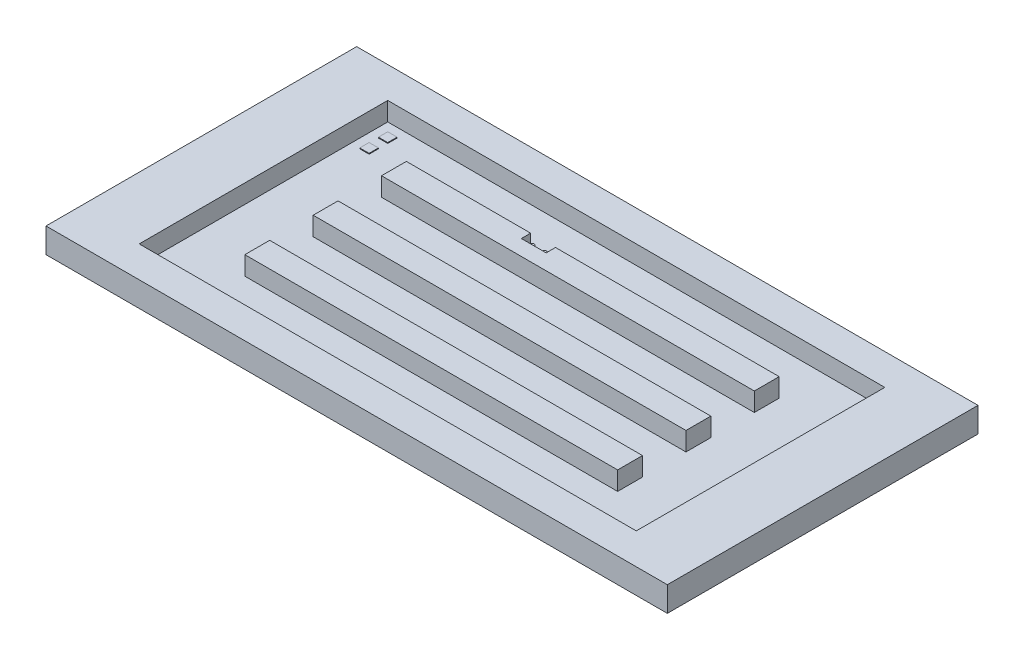
ISO-10303-21;
HEADER;
FILE_DESCRIPTION(('STEP AP214'),'2;1');
FILE_NAME('part.step','',(''),(''),'','','');
FILE_SCHEMA(('AUTOMOTIVE_DESIGN { 1 0 10303 214 1 1 1 1 }'));
ENDSEC;
DATA;
#1=APPLICATION_CONTEXT('core data for automotive mechanical design processes');
#2=APPLICATION_PROTOCOL_DEFINITION('international standard','automotive_design',2000,#1);
#3=PRODUCT_CONTEXT('',#1,'mechanical');
#4=PRODUCT('Part','Part','',(#3));
#5=PRODUCT_RELATED_PRODUCT_CATEGORY('part','',(#4));
#6=PRODUCT_DEFINITION_FORMATION('','',#4);
#7=PRODUCT_DEFINITION_CONTEXT('part definition',#1,'design');
#8=PRODUCT_DEFINITION('design','',#6,#7);
#9=PRODUCT_DEFINITION_SHAPE('','',#8);
#10=(LENGTH_UNIT() NAMED_UNIT(*) SI_UNIT(.MILLI.,.METRE.));
#11=(NAMED_UNIT(*) PLANE_ANGLE_UNIT() SI_UNIT($,.RADIAN.));
#12=(NAMED_UNIT(*) SI_UNIT($,.STERADIAN.) SOLID_ANGLE_UNIT());
#13=UNCERTAINTY_MEASURE_WITH_UNIT(LENGTH_MEASURE(1.E-05),#10,'distance_accuracy_value','');
#14=(GEOMETRIC_REPRESENTATION_CONTEXT(3) GLOBAL_UNCERTAINTY_ASSIGNED_CONTEXT((#13)) GLOBAL_UNIT_ASSIGNED_CONTEXT((#10,
#11,#12)) REPRESENTATION_CONTEXT('',''));
#15=CARTESIAN_POINT('',(0.,0.,0.));
#16=DIRECTION('',(0.,0.,1.));
#17=DIRECTION('',(1.,0.,0.));
#18=AXIS2_PLACEMENT_3D('',#15,#16,#17);
#19=CARTESIAN_POINT('',(-1000.,200.,-1150.));
#20=DIRECTION('',(0.,1.,0.));
#21=DIRECTION('',(0.,0.,1.));
#22=AXIS2_PLACEMENT_3D('',#19,#20,#21);
#23=PLANE('',#22);
#24=CARTESIAN_POINT('',(-900.000000000002,200.,-1221.98698626549));
#25=DIRECTION('',(0.,1.,0.));
#26=DIRECTION('',(0.,0.,1.));
#27=AXIS2_PLACEMENT_3D('',#24,#25,#26);
#28=CIRCLE('',#27,33.);
#29=CARTESIAN_POINT('',(-900.000000000002,200.,-1188.98698626549));
#30=VERTEX_POINT('',#29);
#31=EDGE_CURVE('E265',#30,#30,#28,.T.);
#32=ORIENTED_EDGE('',*,*,#31,.F.);
#33=EDGE_LOOP('',(#32));
#34=FACE_BOUND('',#33,.T.);
#35=DIRECTION('',(0.,0.,1.));
#36=VECTOR('',#35,1.);
#37=CARTESIAN_POINT('',(-1000.,200.,-1300.));
#38=LINE('',#37,#36);
#39=CARTESIAN_POINT('',(-1000.,200.,-1300.));
#40=VERTEX_POINT('',#39);
#41=CARTESIAN_POINT('',(-1000.,200.,-1150.));
#42=VERTEX_POINT('',#41);
#43=EDGE_CURVE('E241',#40,#42,#38,.T.);
#44=ORIENTED_EDGE('',*,*,#43,.T.);
#45=DIRECTION('',(1.,0.,0.));
#46=VECTOR('',#45,1.);
#47=CARTESIAN_POINT('',(-1000.,200.,-1150.));
#48=LINE('',#47,#46);
#49=CARTESIAN_POINT('',(-600.000000000001,200.,-1150.));
#50=VERTEX_POINT('',#49);
#51=EDGE_CURVE('E250',#42,#50,#48,.T.);
#52=ORIENTED_EDGE('',*,*,#51,.T.);
#53=DIRECTION('',(0.,0.,-1.));
#54=VECTOR('',#53,1.);
#55=CARTESIAN_POINT('',(-600.000000000001,200.,-1300.));
#56=LINE('',#55,#54);
#57=CARTESIAN_POINT('',(-600.000000000001,200.,-1300.));
#58=VERTEX_POINT('',#57);
#59=EDGE_CURVE('E255',#50,#58,#56,.T.);
#60=ORIENTED_EDGE('',*,*,#59,.T.);
#61=DIRECTION('',(-1.,0.,0.));
#62=VECTOR('',#61,1.);
#63=CARTESIAN_POINT('',(-1000.,200.,-1300.));
#64=LINE('',#63,#62);
#65=EDGE_CURVE('E247',#58,#40,#64,.T.);
#66=ORIENTED_EDGE('',*,*,#65,.T.);
#67=EDGE_LOOP('',(#44,#52,#60,#66));
#68=FACE_BOUND('',#67,.T.);
#69=CARTESIAN_POINT('',(-700.000000000002,200.,-1221.98698626549));
#70=DIRECTION('',(0.,1.,0.));
#71=DIRECTION('',(0.,0.,1.));
#72=AXIS2_PLACEMENT_3D('',#69,#70,#71);
#73=CIRCLE('',#72,33.);
#74=CARTESIAN_POINT('',(-700.000000000002,200.,-1188.98698626549));
#75=VERTEX_POINT('',#74);
#76=EDGE_CURVE('E943',#75,#75,#73,.T.);
#77=ORIENTED_EDGE('',*,*,#76,.F.);
#78=EDGE_LOOP('',(#77));
#79=FACE_BOUND('',#78,.T.);
#80=ADVANCED_FACE('F31',(#34,#68,#79),#23,.T.);
#81=CARTESIAN_POINT('',(-4000.,100.,2000.));
#82=DIRECTION('',(0.,-1.,0.));
#83=DIRECTION('',(0.,0.,-1.));
#84=AXIS2_PLACEMENT_3D('',#81,#82,#83);
#85=PLANE('',#84);
#86=DIRECTION('',(0.,0.,1.));
#87=VECTOR('',#86,1.);
#88=CARTESIAN_POINT('',(-3850.,100.,-1850.));
#89=LINE('',#88,#87);
#90=CARTESIAN_POINT('',(-3850.,100.,-1850.));
#91=VERTEX_POINT('',#90);
#92=CARTESIAN_POINT('',(-3850.,100.,-1700.));
#93=VERTEX_POINT('',#92);
#94=EDGE_CURVE('E309',#91,#93,#89,.T.);
#95=ORIENTED_EDGE('',*,*,#94,.F.);
#96=DIRECTION('',(-1.,0.,0.));
#97=VECTOR('',#96,1.);
#98=CARTESIAN_POINT('',(-3850.,100.,-1850.));
#99=LINE('',#98,#97);
#100=CARTESIAN_POINT('',(-3700.,100.,-1850.));
#101=VERTEX_POINT('',#100);
#102=EDGE_CURVE('E314',#101,#91,#99,.T.);
#103=ORIENTED_EDGE('',*,*,#102,.F.);
#104=DIRECTION('',(0.,0.,-1.));
#105=VECTOR('',#104,1.);
#106=CARTESIAN_POINT('',(-3700.,100.,-1850.));
#107=LINE('',#106,#105);
#108=CARTESIAN_POINT('',(-3700.,100.,-1700.));
#109=VERTEX_POINT('',#108);
#110=EDGE_CURVE('E326',#109,#101,#107,.T.);
#111=ORIENTED_EDGE('',*,*,#110,.F.);
#112=DIRECTION('',(1.,0.,0.));
#113=VECTOR('',#112,1.);
#114=CARTESIAN_POINT('',(-3850.,100.,-1700.));
#115=LINE('',#114,#113);
#116=EDGE_CURVE('E323',#93,#109,#115,.T.);
#117=ORIENTED_EDGE('',*,*,#116,.F.);
#118=EDGE_LOOP('',(#95,#103,#111,#117));
#119=FACE_BOUND('',#118,.T.);
#120=DIRECTION('',(0.,0.,1.));
#121=VECTOR('',#120,1.);
#122=CARTESIAN_POINT('',(-3000.,100.,900.000000000001));
#123=LINE('',#122,#121);
#124=CARTESIAN_POINT('',(-3000.,100.,900.000000000001));
#125=VERTEX_POINT('',#124);
#126=CARTESIAN_POINT('',(-3000.,100.,1300.));
#127=VERTEX_POINT('',#126);
#128=EDGE_CURVE('E343',#125,#127,#123,.T.);
#129=ORIENTED_EDGE('',*,*,#128,.F.);
#130=DIRECTION('',(-1.,0.,0.));
#131=VECTOR('',#130,1.);
#132=CARTESIAN_POINT('',(-3000.,100.,900.000000000001));
#133=LINE('',#132,#131);
#134=CARTESIAN_POINT('',(3000.,100.,900.000000000001));
#135=VERTEX_POINT('',#134);
#136=EDGE_CURVE('E353',#135,#125,#133,.T.);
#137=ORIENTED_EDGE('',*,*,#136,.F.);
#138=DIRECTION('',(0.,0.,-1.));
#139=VECTOR('',#138,1.);
#140=CARTESIAN_POINT('',(3000.,100.,900.000000000001));
#141=LINE('',#140,#139);
#142=CARTESIAN_POINT('',(3000.,100.,1300.));
#143=VERTEX_POINT('',#142);
#144=EDGE_CURVE('E350',#143,#135,#141,.T.);
#145=ORIENTED_EDGE('',*,*,#144,.F.);
#146=DIRECTION('',(1.,0.,0.));
#147=VECTOR('',#146,1.);
#148=CARTESIAN_POINT('',(-3000.,100.,1300.));
#149=LINE('',#148,#147);
#150=EDGE_CURVE('E346',#127,#143,#149,.T.);
#151=ORIENTED_EDGE('',*,*,#150,.F.);
#152=EDGE_LOOP('',(#129,#137,#145,#151));
#153=FACE_BOUND('',#152,.T.);
#154=DIRECTION('',(0.,0.,-1.));
#155=VECTOR('',#154,1.);
#156=CARTESIAN_POINT('',(3000.,100.,-200.));
#157=LINE('',#156,#155);
#158=CARTESIAN_POINT('',(3000.,100.,200.));
#159=VERTEX_POINT('',#158);
#160=CARTESIAN_POINT('',(3000.,100.,-200.));
#161=VERTEX_POINT('',#160);
#162=EDGE_CURVE('E376',#159,#161,#157,.T.);
#163=ORIENTED_EDGE('',*,*,#162,.F.);
#164=DIRECTION('',(1.,0.,0.));
#165=VECTOR('',#164,1.);
#166=CARTESIAN_POINT('',(3000.,100.,200.));
#167=LINE('',#166,#165);
#168=CARTESIAN_POINT('',(-3000.,100.,200.000000000001));
#169=VERTEX_POINT('',#168);
#170=EDGE_CURVE('E386',#169,#159,#167,.T.);
#171=ORIENTED_EDGE('',*,*,#170,.F.);
#172=DIRECTION('',(0.,0.,1.));
#173=VECTOR('',#172,1.);
#174=CARTESIAN_POINT('',(-3000.,100.,-199.999999999999));
#175=LINE('',#174,#173);
#176=CARTESIAN_POINT('',(-3000.,100.,-199.999999999999));
#177=VERTEX_POINT('',#176);
#178=EDGE_CURVE('E383',#177,#169,#175,.T.);
#179=ORIENTED_EDGE('',*,*,#178,.F.);
#180=DIRECTION('',(-1.,0.,0.));
#181=VECTOR('',#180,1.);
#182=CARTESIAN_POINT('',(3000.,100.,-200.));
#183=LINE('',#182,#181);
#184=EDGE_CURVE('E379',#161,#177,#183,.T.);
#185=ORIENTED_EDGE('',*,*,#184,.F.);
#186=EDGE_LOOP('',(#163,#171,#179,#185));
#187=FACE_BOUND('',#186,.T.);
#188=DIRECTION('',(0.,0.,1.));
#189=VECTOR('',#188,1.);
#190=CARTESIAN_POINT('',(-3000.,100.,-1300.));
#191=LINE('',#190,#189);
#192=CARTESIAN_POINT('',(-3000.,100.,-1300.));
#193=VERTEX_POINT('',#192);
#194=CARTESIAN_POINT('',(-3000.,100.,-899.999999999999));
#195=VERTEX_POINT('',#194);
#196=EDGE_CURVE('E409',#193,#195,#191,.T.);
#197=ORIENTED_EDGE('',*,*,#196,.F.);
#198=DIRECTION('',(-1.,0.,0.));
#199=VECTOR('',#198,1.);
#200=CARTESIAN_POINT('',(-3000.,100.,-1300.));
#201=LINE('',#200,#199);
#202=CARTESIAN_POINT('',(3000.,100.,-1300.));
#203=VERTEX_POINT('',#202);
#204=EDGE_CURVE('E419',#203,#193,#201,.T.);
#205=ORIENTED_EDGE('',*,*,#204,.F.);
#206=DIRECTION('',(0.,0.,-1.));
#207=VECTOR('',#206,1.);
#208=CARTESIAN_POINT('',(3000.,100.,-1300.));
#209=LINE('',#208,#207);
#210=CARTESIAN_POINT('',(3000.,100.,-899.999999999999));
#211=VERTEX_POINT('',#210);
#212=EDGE_CURVE('E416',#211,#203,#209,.T.);
#213=ORIENTED_EDGE('',*,*,#212,.F.);
#214=DIRECTION('',(1.,0.,0.));
#215=VECTOR('',#214,1.);
#216=CARTESIAN_POINT('',(-3000.,100.,-899.999999999999));
#217=LINE('',#216,#215);
#218=EDGE_CURVE('E412',#195,#211,#217,.T.);
#219=ORIENTED_EDGE('',*,*,#218,.F.);
#220=EDGE_LOOP('',(#197,#205,#213,#219));
#221=FACE_BOUND('',#220,.T.);
#222=DIRECTION('',(0.,0.,1.));
#223=VECTOR('',#222,1.);
#224=CARTESIAN_POINT('',(-4000.,100.,-2000.));
#225=LINE('',#224,#223);
#226=CARTESIAN_POINT('',(-4000.,100.,-2000.));
#227=VERTEX_POINT('',#226);
#228=CARTESIAN_POINT('',(-4000.,100.,2000.));
#229=VERTEX_POINT('',#228);
#230=EDGE_CURVE('E444',#227,#229,#225,.T.);
#231=ORIENTED_EDGE('',*,*,#230,.T.);
#232=DIRECTION('',(1.,0.,0.));
#233=VECTOR('',#232,1.);
#234=CARTESIAN_POINT('',(4000.,100.,2000.));
#235=LINE('',#234,#233);
#236=CARTESIAN_POINT('',(4000.,100.,2000.));
#237=VERTEX_POINT('',#236);
#238=EDGE_CURVE('E447',#229,#237,#235,.T.);
#239=ORIENTED_EDGE('',*,*,#238,.T.);
#240=DIRECTION('',(0.,0.,-1.));
#241=VECTOR('',#240,1.);
#242=CARTESIAN_POINT('',(4000.,100.,-2000.));
#243=LINE('',#242,#241);
#244=CARTESIAN_POINT('',(4000.,100.,-2000.));
#245=VERTEX_POINT('',#244);
#246=EDGE_CURVE('E451',#237,#245,#243,.T.);
#247=ORIENTED_EDGE('',*,*,#246,.T.);
#248=DIRECTION('',(-1.,0.,0.));
#249=VECTOR('',#248,1.);
#250=CARTESIAN_POINT('',(4000.,100.,-2000.));
#251=LINE('',#250,#249);
#252=EDGE_CURVE('E454',#245,#227,#251,.T.);
#253=ORIENTED_EDGE('',*,*,#252,.T.);
#254=EDGE_LOOP('',(#231,#239,#247,#253));
#255=FACE_BOUND('',#254,.T.);
#256=DIRECTION('',(0.,0.,-1.));
#257=VECTOR('',#256,1.);
#258=CARTESIAN_POINT('',(-3700.,100.,-1550.));
#259=LINE('',#258,#257);
#260=CARTESIAN_POINT('',(-3700.,100.,-1400.));
#261=VERTEX_POINT('',#260);
#262=CARTESIAN_POINT('',(-3700.,100.,-1550.));
#263=VERTEX_POINT('',#262);
#264=EDGE_CURVE('E275',#261,#263,#259,.T.);
#265=ORIENTED_EDGE('',*,*,#264,.F.);
#266=DIRECTION('',(1.,0.,0.));
#267=VECTOR('',#266,1.);
#268=CARTESIAN_POINT('',(-3700.,100.,-1400.));
#269=LINE('',#268,#267);
#270=CARTESIAN_POINT('',(-3850.,100.,-1400.));
#271=VERTEX_POINT('',#270);
#272=EDGE_CURVE('E284',#271,#261,#269,.T.);
#273=ORIENTED_EDGE('',*,*,#272,.F.);
#274=DIRECTION('',(0.,0.,1.));
#275=VECTOR('',#274,1.);
#276=CARTESIAN_POINT('',(-3850.,100.,-1550.));
#277=LINE('',#276,#275);
#278=CARTESIAN_POINT('',(-3850.,100.,-1550.));
#279=VERTEX_POINT('',#278);
#280=EDGE_CURVE('E294',#279,#271,#277,.T.);
#281=ORIENTED_EDGE('',*,*,#280,.F.);
#282=DIRECTION('',(-1.,0.,0.));
#283=VECTOR('',#282,1.);
#284=CARTESIAN_POINT('',(-3700.,100.,-1550.));
#285=LINE('',#284,#283);
#286=EDGE_CURVE('E54',#263,#279,#285,.T.);
#287=ORIENTED_EDGE('',*,*,#286,.F.);
#288=EDGE_LOOP('',(#265,#273,#281,#287));
#289=FACE_BOUND('',#288,.T.);
#290=ADVANCED_FACE('F526',(#119,#153,#187,#221,#255,#289),#85,.F.);
#291=CARTESIAN_POINT('',(5000.,400.,-2500.));
#292=DIRECTION('',(-1.,0.,0.));
#293=DIRECTION('',(0.,0.,1.));
#294=AXIS2_PLACEMENT_3D('',#291,#292,#293);
#295=PLANE('',#294);
#296=DIRECTION('',(0.,0.,-1.));
#297=VECTOR('',#296,1.);
#298=CARTESIAN_POINT('',(5000.,0.,-2500.));
#299=LINE('',#298,#297);
#300=CARTESIAN_POINT('',(5000.,0.,2500.));
#301=VERTEX_POINT('',#300);
#302=CARTESIAN_POINT('',(5000.,0.,-2500.));
#303=VERTEX_POINT('',#302);
#304=EDGE_CURVE('E469',#301,#303,#299,.T.);
#305=ORIENTED_EDGE('',*,*,#304,.T.);
#306=DIRECTION('',(0.,-1.,0.));
#307=VECTOR('',#306,1.);
#308=CARTESIAN_POINT('',(5000.,400.,-2500.));
#309=LINE('',#308,#307);
#310=CARTESIAN_POINT('',(5000.,400.,-2500.));
#311=VERTEX_POINT('',#310);
#312=EDGE_CURVE('E11',#311,#303,#309,.T.);
#313=ORIENTED_EDGE('',*,*,#312,.F.);
#314=DIRECTION('',(0.,0.,-1.));
#315=VECTOR('',#314,1.);
#316=CARTESIAN_POINT('',(5000.,400.,-2500.));
#317=LINE('',#316,#315);
#318=CARTESIAN_POINT('',(5000.,400.,2500.));
#319=VERTEX_POINT('',#318);
#320=EDGE_CURVE('E476',#319,#311,#317,.T.);
#321=ORIENTED_EDGE('',*,*,#320,.F.);
#322=DIRECTION('',(0.,-1.,0.));
#323=VECTOR('',#322,1.);
#324=CARTESIAN_POINT('',(5000.,400.,2500.));
#325=LINE('',#324,#323);
#326=EDGE_CURVE('E486',#319,#301,#325,.T.);
#327=ORIENTED_EDGE('',*,*,#326,.T.);
#328=EDGE_LOOP('',(#305,#313,#321,#327));
#329=FACE_BOUND('',#328,.T.);
#330=ADVANCED_FACE('F33',(#329),#295,.F.);
#331=CARTESIAN_POINT('',(-5000.,400.,-2500.));
#332=DIRECTION('',(0.,0.,1.));
#333=DIRECTION('',(1.,0.,0.));
#334=AXIS2_PLACEMENT_3D('',#331,#332,#333);
#335=PLANE('',#334);
#336=DIRECTION('',(-1.,0.,0.));
#337=VECTOR('',#336,1.);
#338=CARTESIAN_POINT('',(-5000.,0.,-2500.));
#339=LINE('',#338,#337);
#340=CARTESIAN_POINT('',(-5000.,0.,-2500.));
#341=VERTEX_POINT('',#340);
#342=EDGE_CURVE('E489',#303,#341,#339,.T.);
#343=ORIENTED_EDGE('',*,*,#342,.T.);
#344=DIRECTION('',(0.,-1.,0.));
#345=VECTOR('',#344,1.);
#346=CARTESIAN_POINT('',(-5000.,400.,-2500.));
#347=LINE('',#346,#345);
#348=CARTESIAN_POINT('',(-5000.,400.,-2500.));
#349=VERTEX_POINT('',#348);
#350=EDGE_CURVE('E39',#349,#341,#347,.T.);
#351=ORIENTED_EDGE('',*,*,#350,.F.);
#352=DIRECTION('',(-1.,0.,0.));
#353=VECTOR('',#352,1.);
#354=CARTESIAN_POINT('',(-5000.,400.,-2500.));
#355=LINE('',#354,#353);
#356=EDGE_CURVE('E479',#311,#349,#355,.T.);
#357=ORIENTED_EDGE('',*,*,#356,.F.);
#358=ORIENTED_EDGE('',*,*,#312,.T.);
#359=EDGE_LOOP('',(#343,#351,#357,#358));
#360=FACE_BOUND('',#359,.T.);
#361=ADVANCED_FACE('F519',(#360),#335,.F.);
#362=CARTESIAN_POINT('',(-5000.,400.,-2500.));
#363=DIRECTION('',(1.,0.,0.));
#364=DIRECTION('',(0.,0.,-1.));
#365=AXIS2_PLACEMENT_3D('',#362,#363,#364);
#366=PLANE('',#365);
#367=DIRECTION('',(0.,0.,1.));
#368=VECTOR('',#367,1.);
#369=CARTESIAN_POINT('',(-5000.,0.,-2500.));
#370=LINE('',#369,#368);
#371=CARTESIAN_POINT('',(-5000.,0.,2500.));
#372=VERTEX_POINT('',#371);
#373=EDGE_CURVE('E491',#341,#372,#370,.T.);
#374=ORIENTED_EDGE('',*,*,#373,.T.);
#375=DIRECTION('',(0.,-1.,0.));
#376=VECTOR('',#375,1.);
#377=CARTESIAN_POINT('',(-5000.,400.,2500.));
#378=LINE('',#377,#376);
#379=CARTESIAN_POINT('',(-5000.,400.,2500.));
#380=VERTEX_POINT('',#379);
#381=EDGE_CURVE('E496',#380,#372,#378,.T.);
#382=ORIENTED_EDGE('',*,*,#381,.F.);
#383=DIRECTION('',(0.,0.,1.));
#384=VECTOR('',#383,1.);
#385=CARTESIAN_POINT('',(-5000.,400.,-2500.));
#386=LINE('',#385,#384);
#387=EDGE_CURVE('E482',#349,#380,#386,.T.);
#388=ORIENTED_EDGE('',*,*,#387,.F.);
#389=ORIENTED_EDGE('',*,*,#350,.T.);
#390=EDGE_LOOP('',(#374,#382,#388,#389));
#391=FACE_BOUND('',#390,.T.);
#392=ADVANCED_FACE('F503',(#391),#366,.F.);
#393=CARTESIAN_POINT('',(-5000.,400.,2500.));
#394=DIRECTION('',(0.,0.,-1.));
#395=DIRECTION('',(-1.,0.,0.));
#396=AXIS2_PLACEMENT_3D('',#393,#394,#395);
#397=PLANE('',#396);
#398=DIRECTION('',(1.,0.,0.));
#399=VECTOR('',#398,1.);
#400=CARTESIAN_POINT('',(-5000.,0.,2500.));
#401=LINE('',#400,#399);
#402=EDGE_CURVE('E480',#372,#301,#401,.T.);
#403=ORIENTED_EDGE('',*,*,#402,.T.);
#404=ORIENTED_EDGE('',*,*,#326,.F.);
#405=DIRECTION('',(1.,0.,0.));
#406=VECTOR('',#405,1.);
#407=CARTESIAN_POINT('',(-5000.,400.,2500.));
#408=LINE('',#407,#406);
#409=EDGE_CURVE('E484',#380,#319,#408,.T.);
#410=ORIENTED_EDGE('',*,*,#409,.F.);
#411=ORIENTED_EDGE('',*,*,#381,.T.);
#412=EDGE_LOOP('',(#403,#404,#410,#411));
#413=FACE_BOUND('',#412,.T.);
#414=ADVANCED_FACE('F512',(#413),#397,.F.);
#415=CARTESIAN_POINT('',(5000.,400.,2500.));
#416=DIRECTION('',(0.,1.,0.));
#417=DIRECTION('',(0.,0.,1.));
#418=AXIS2_PLACEMENT_3D('',#415,#416,#417);
#419=PLANE('',#418);
#420=DIRECTION('',(0.,0.,1.));
#421=VECTOR('',#420,1.);
#422=CARTESIAN_POINT('',(-4000.,400.,-2000.));
#423=LINE('',#422,#421);
#424=CARTESIAN_POINT('',(-4000.,400.,-2000.));
#425=VERTEX_POINT('',#424);
#426=CARTESIAN_POINT('',(-4000.,400.,2000.));
#427=VERTEX_POINT('',#426);
#428=EDGE_CURVE('E437',#425,#427,#423,.T.);
#429=ORIENTED_EDGE('',*,*,#428,.F.);
#430=DIRECTION('',(-1.,0.,0.));
#431=VECTOR('',#430,1.);
#432=CARTESIAN_POINT('',(4000.,400.,-2000.));
#433=LINE('',#432,#431);
#434=CARTESIAN_POINT('',(4000.,400.,-2000.));
#435=VERTEX_POINT('',#434);
#436=EDGE_CURVE('E448',#435,#425,#433,.T.);
#437=ORIENTED_EDGE('',*,*,#436,.F.);
#438=DIRECTION('',(0.,0.,-1.));
#439=VECTOR('',#438,1.);
#440=CARTESIAN_POINT('',(4000.,400.,-2000.));
#441=LINE('',#440,#439);
#442=CARTESIAN_POINT('',(4000.,400.,2000.));
#443=VERTEX_POINT('',#442);
#444=EDGE_CURVE('E462',#443,#435,#441,.T.);
#445=ORIENTED_EDGE('',*,*,#444,.F.);
#446=DIRECTION('',(1.,0.,0.));
#447=VECTOR('',#446,1.);
#448=CARTESIAN_POINT('',(4000.,400.,2000.));
#449=LINE('',#448,#447);
#450=EDGE_CURVE('E459',#427,#443,#449,.T.);
#451=ORIENTED_EDGE('',*,*,#450,.F.);
#452=EDGE_LOOP('',(#429,#437,#445,#451));
#453=FACE_BOUND('',#452,.T.);
#454=ORIENTED_EDGE('',*,*,#320,.T.);
#455=ORIENTED_EDGE('',*,*,#356,.T.);
#456=ORIENTED_EDGE('',*,*,#387,.T.);
#457=ORIENTED_EDGE('',*,*,#409,.T.);
#458=EDGE_LOOP('',(#454,#455,#456,#457));
#459=FACE_BOUND('',#458,.T.);
#460=ADVANCED_FACE('F518',(#453,#459),#419,.T.);
#461=CARTESIAN_POINT('',(5000.,0.,2500.));
#462=DIRECTION('',(0.,1.,0.));
#463=DIRECTION('',(0.,0.,1.));
#464=AXIS2_PLACEMENT_3D('',#461,#462,#463);
#465=PLANE('',#464);
#466=ORIENTED_EDGE('',*,*,#304,.F.);
#467=ORIENTED_EDGE('',*,*,#402,.F.);
#468=ORIENTED_EDGE('',*,*,#373,.F.);
#469=ORIENTED_EDGE('',*,*,#342,.F.);
#470=EDGE_LOOP('',(#466,#467,#468,#469));
#471=FACE_BOUND('',#470,.T.);
#472=ADVANCED_FACE('F509',(#471),#465,.F.);
#473=CARTESIAN_POINT('',(-4000.,100.,-2000.));
#474=DIRECTION('',(-1.,0.,0.));
#475=DIRECTION('',(0.,0.,1.));
#476=AXIS2_PLACEMENT_3D('',#473,#474,#475);
#477=PLANE('',#476);
#478=ORIENTED_EDGE('',*,*,#428,.T.);
#479=DIRECTION('',(0.,1.,0.));
#480=VECTOR('',#479,1.);
#481=CARTESIAN_POINT('',(-4000.,100.,2000.));
#482=LINE('',#481,#480);
#483=EDGE_CURVE('E457',#229,#427,#482,.T.);
#484=ORIENTED_EDGE('',*,*,#483,.F.);
#485=ORIENTED_EDGE('',*,*,#230,.F.);
#486=DIRECTION('',(0.,1.,0.));
#487=VECTOR('',#486,1.);
#488=CARTESIAN_POINT('',(-4000.,100.,-2000.));
#489=LINE('',#488,#487);
#490=EDGE_CURVE('E467',#227,#425,#489,.T.);
#491=ORIENTED_EDGE('',*,*,#490,.T.);
#492=EDGE_LOOP('',(#478,#484,#485,#491));
#493=FACE_BOUND('',#492,.T.);
#494=ADVANCED_FACE('F643',(#493),#477,.F.);
#495=CARTESIAN_POINT('',(4000.,100.,-2000.));
#496=DIRECTION('',(0.,0.,-1.));
#497=DIRECTION('',(-1.,0.,0.));
#498=AXIS2_PLACEMENT_3D('',#495,#496,#497);
#499=PLANE('',#498);
#500=ORIENTED_EDGE('',*,*,#436,.T.);
#501=ORIENTED_EDGE('',*,*,#490,.F.);
#502=ORIENTED_EDGE('',*,*,#252,.F.);
#503=DIRECTION('',(0.,1.,0.));
#504=VECTOR('',#503,1.);
#505=CARTESIAN_POINT('',(4000.,100.,-2000.));
#506=LINE('',#505,#504);
#507=EDGE_CURVE('E470',#245,#435,#506,.T.);
#508=ORIENTED_EDGE('',*,*,#507,.T.);
#509=EDGE_LOOP('',(#500,#501,#502,#508));
#510=FACE_BOUND('',#509,.T.);
#511=ADVANCED_FACE('F639',(#510),#499,.F.);
#512=CARTESIAN_POINT('',(4000.,100.,-2000.));
#513=DIRECTION('',(1.,0.,0.));
#514=DIRECTION('',(0.,0.,-1.));
#515=AXIS2_PLACEMENT_3D('',#512,#513,#514);
#516=PLANE('',#515);
#517=ORIENTED_EDGE('',*,*,#444,.T.);
#518=ORIENTED_EDGE('',*,*,#507,.F.);
#519=ORIENTED_EDGE('',*,*,#246,.F.);
#520=DIRECTION('',(0.,1.,0.));
#521=VECTOR('',#520,1.);
#522=CARTESIAN_POINT('',(4000.,100.,2000.));
#523=LINE('',#522,#521);
#524=EDGE_CURVE('E472',#237,#443,#523,.T.);
#525=ORIENTED_EDGE('',*,*,#524,.T.);
#526=EDGE_LOOP('',(#517,#518,#519,#525));
#527=FACE_BOUND('',#526,.T.);
#528=ADVANCED_FACE('F642',(#527),#516,.F.);
#529=CARTESIAN_POINT('',(4000.,100.,2000.));
#530=DIRECTION('',(0.,0.,1.));
#531=DIRECTION('',(1.,0.,0.));
#532=AXIS2_PLACEMENT_3D('',#529,#530,#531);
#533=PLANE('',#532);
#534=ORIENTED_EDGE('',*,*,#450,.T.);
#535=ORIENTED_EDGE('',*,*,#524,.F.);
#536=ORIENTED_EDGE('',*,*,#238,.F.);
#537=ORIENTED_EDGE('',*,*,#483,.T.);
#538=EDGE_LOOP('',(#534,#535,#536,#537));
#539=FACE_BOUND('',#538,.T.);
#540=ADVANCED_FACE('F636',(#539),#533,.F.);
#541=CARTESIAN_POINT('',(-3000.,100.,-1300.));
#542=DIRECTION('',(-1.,0.,0.));
#543=DIRECTION('',(0.,0.,1.));
#544=AXIS2_PLACEMENT_3D('',#541,#542,#543);
#545=PLANE('',#544);
#546=DIRECTION('',(0.,0.,1.));
#547=VECTOR('',#546,1.);
#548=CARTESIAN_POINT('',(-3000.,400.,-1300.));
#549=LINE('',#548,#547);
#550=CARTESIAN_POINT('',(-3000.,400.,-1300.));
#551=VERTEX_POINT('',#550);
#552=CARTESIAN_POINT('',(-3000.,400.,-899.999999999999));
#553=VERTEX_POINT('',#552);
#554=EDGE_CURVE('E402',#551,#553,#549,.T.);
#555=ORIENTED_EDGE('',*,*,#554,.F.);
#556=DIRECTION('',(0.,1.,0.));
#557=VECTOR('',#556,1.);
#558=CARTESIAN_POINT('',(-3000.,100.,-1300.));
#559=LINE('',#558,#557);
#560=EDGE_CURVE('E434',#193,#551,#559,.T.);
#561=ORIENTED_EDGE('',*,*,#560,.F.);
#562=ORIENTED_EDGE('',*,*,#196,.T.);
#563=DIRECTION('',(0.,1.,0.));
#564=VECTOR('',#563,1.);
#565=CARTESIAN_POINT('',(-3000.,100.,-899.999999999999));
#566=LINE('',#565,#564);
#567=EDGE_CURVE('E422',#195,#553,#566,.T.);
#568=ORIENTED_EDGE('',*,*,#567,.T.);
#569=EDGE_LOOP('',(#555,#561,#562,#568));
#570=FACE_BOUND('',#569,.T.);
#571=ADVANCED_FACE('F627',(#570),#545,.T.);
#572=CARTESIAN_POINT('',(-3000.,100.,-1300.));
#573=DIRECTION('',(0.,0.,-1.));
#574=DIRECTION('',(-1.,0.,0.));
#575=AXIS2_PLACEMENT_3D('',#572,#573,#574);
#576=PLANE('',#575);
#577=DIRECTION('',(0.,1.,0.));
#578=VECTOR('',#577,1.);
#579=CARTESIAN_POINT('',(-1000.,200.,-1300.));
#580=LINE('',#579,#578);
#581=CARTESIAN_POINT('',(-1000.,400.,-1300.));
#582=VERTEX_POINT('',#581);
#583=EDGE_CURVE('E273',#40,#582,#580,.T.);
#584=ORIENTED_EDGE('',*,*,#583,.F.);
#585=ORIENTED_EDGE('',*,*,#65,.F.);
#586=DIRECTION('',(0.,1.,0.));
#587=VECTOR('',#586,1.);
#588=CARTESIAN_POINT('',(-600.000000000001,200.,-1300.));
#589=LINE('',#588,#587);
#590=CARTESIAN_POINT('',(-600.000000000001,400.,-1300.));
#591=VERTEX_POINT('',#590);
#592=EDGE_CURVE('E276',#58,#591,#589,.T.);
#593=ORIENTED_EDGE('',*,*,#592,.T.);
#594=DIRECTION('',(-1.,0.,0.));
#595=VECTOR('',#594,1.);
#596=CARTESIAN_POINT('',(-3000.,400.,-1300.));
#597=LINE('',#596,#595);
#598=CARTESIAN_POINT('',(3000.,400.,-1300.));
#599=VERTEX_POINT('',#598);
#600=EDGE_CURVE('E413',#599,#591,#597,.T.);
#601=ORIENTED_EDGE('',*,*,#600,.F.);
#602=DIRECTION('',(0.,1.,0.));
#603=VECTOR('',#602,1.);
#604=CARTESIAN_POINT('',(3000.,100.,-1300.));
#605=LINE('',#604,#603);
#606=EDGE_CURVE('E438',#203,#599,#605,.T.);
#607=ORIENTED_EDGE('',*,*,#606,.F.);
#608=ORIENTED_EDGE('',*,*,#204,.T.);
#609=ORIENTED_EDGE('',*,*,#560,.T.);
#610=EDGE_CURVE('E431',#582,#551,#597,.T.);
#611=ORIENTED_EDGE('',*,*,#610,.F.);
#612=EDGE_LOOP('',(#584,#585,#593,#601,#607,#608,#609,#611));
#613=FACE_BOUND('',#612,.T.);
#614=ADVANCED_FACE('F623',(#613),#576,.T.);
#615=CARTESIAN_POINT('',(3000.,100.,-1300.));
#616=DIRECTION('',(1.,0.,0.));
#617=DIRECTION('',(0.,0.,-1.));
#618=AXIS2_PLACEMENT_3D('',#615,#616,#617);
#619=PLANE('',#618);
#620=DIRECTION('',(0.,0.,-1.));
#621=VECTOR('',#620,1.);
#622=CARTESIAN_POINT('',(3000.,400.,-1300.));
#623=LINE('',#622,#621);
#624=CARTESIAN_POINT('',(3000.,400.,-899.999999999999));
#625=VERTEX_POINT('',#624);
#626=EDGE_CURVE('E428',#625,#599,#623,.T.);
#627=ORIENTED_EDGE('',*,*,#626,.F.);
#628=DIRECTION('',(0.,1.,0.));
#629=VECTOR('',#628,1.);
#630=CARTESIAN_POINT('',(3000.,100.,-899.999999999999));
#631=LINE('',#630,#629);
#632=EDGE_CURVE('E440',#211,#625,#631,.T.);
#633=ORIENTED_EDGE('',*,*,#632,.F.);
#634=ORIENTED_EDGE('',*,*,#212,.T.);
#635=ORIENTED_EDGE('',*,*,#606,.T.);
#636=EDGE_LOOP('',(#627,#633,#634,#635));
#637=FACE_BOUND('',#636,.T.);
#638=ADVANCED_FACE('F626',(#637),#619,.T.);
#639=CARTESIAN_POINT('',(-3000.,100.,-899.999999999999));
#640=DIRECTION('',(0.,0.,1.));
#641=DIRECTION('',(1.,0.,0.));
#642=AXIS2_PLACEMENT_3D('',#639,#640,#641);
#643=PLANE('',#642);
#644=DIRECTION('',(1.,0.,0.));
#645=VECTOR('',#644,1.);
#646=CARTESIAN_POINT('',(-3000.,400.,-899.999999999999));
#647=LINE('',#646,#645);
#648=EDGE_CURVE('E425',#553,#625,#647,.T.);
#649=ORIENTED_EDGE('',*,*,#648,.F.);
#650=ORIENTED_EDGE('',*,*,#567,.F.);
#651=ORIENTED_EDGE('',*,*,#218,.T.);
#652=ORIENTED_EDGE('',*,*,#632,.T.);
#653=EDGE_LOOP('',(#649,#650,#651,#652));
#654=FACE_BOUND('',#653,.T.);
#655=ADVANCED_FACE('F621',(#654),#643,.T.);
#656=CARTESIAN_POINT('',(3000.,100.,-200.));
#657=DIRECTION('',(1.,0.,0.));
#658=DIRECTION('',(0.,0.,-1.));
#659=AXIS2_PLACEMENT_3D('',#656,#657,#658);
#660=PLANE('',#659);
#661=DIRECTION('',(0.,0.,-1.));
#662=VECTOR('',#661,1.);
#663=CARTESIAN_POINT('',(3000.,400.,-200.));
#664=LINE('',#663,#662);
#665=CARTESIAN_POINT('',(3000.,400.,200.));
#666=VERTEX_POINT('',#665);
#667=CARTESIAN_POINT('',(3000.,400.,-200.));
#668=VERTEX_POINT('',#667);
#669=EDGE_CURVE('E369',#666,#668,#664,.T.);
#670=ORIENTED_EDGE('',*,*,#669,.F.);
#671=DIRECTION('',(0.,1.,0.));
#672=VECTOR('',#671,1.);
#673=CARTESIAN_POINT('',(3000.,100.,200.));
#674=LINE('',#673,#672);
#675=EDGE_CURVE('E400',#159,#666,#674,.T.);
#676=ORIENTED_EDGE('',*,*,#675,.F.);
#677=ORIENTED_EDGE('',*,*,#162,.T.);
#678=DIRECTION('',(0.,1.,0.));
#679=VECTOR('',#678,1.);
#680=CARTESIAN_POINT('',(3000.,100.,-200.));
#681=LINE('',#680,#679);
#682=EDGE_CURVE('E389',#161,#668,#681,.T.);
#683=ORIENTED_EDGE('',*,*,#682,.T.);
#684=EDGE_LOOP('',(#670,#676,#677,#683));
#685=FACE_BOUND('',#684,.T.);
#686=ADVANCED_FACE('F611',(#685),#660,.T.);
#687=CARTESIAN_POINT('',(3000.,100.,200.));
#688=DIRECTION('',(0.,0.,1.));
#689=DIRECTION('',(1.,0.,0.));
#690=AXIS2_PLACEMENT_3D('',#687,#688,#689);
#691=PLANE('',#690);
#692=DIRECTION('',(1.,0.,0.));
#693=VECTOR('',#692,1.);
#694=CARTESIAN_POINT('',(3000.,400.,200.));
#695=LINE('',#694,#693);
#696=CARTESIAN_POINT('',(-3000.,400.,200.000000000001));
#697=VERTEX_POINT('',#696);
#698=EDGE_CURVE('E380',#697,#666,#695,.T.);
#699=ORIENTED_EDGE('',*,*,#698,.F.);
#700=DIRECTION('',(0.,1.,0.));
#701=VECTOR('',#700,1.);
#702=CARTESIAN_POINT('',(-3000.,100.,200.000000000001));
#703=LINE('',#702,#701);
#704=EDGE_CURVE('E403',#169,#697,#703,.T.);
#705=ORIENTED_EDGE('',*,*,#704,.F.);
#706=ORIENTED_EDGE('',*,*,#170,.T.);
#707=ORIENTED_EDGE('',*,*,#675,.T.);
#708=EDGE_LOOP('',(#699,#705,#706,#707));
#709=FACE_BOUND('',#708,.T.);
#710=ADVANCED_FACE('F607',(#709),#691,.T.);
#711=CARTESIAN_POINT('',(-3000.,100.,-199.999999999999));
#712=DIRECTION('',(-1.,0.,0.));
#713=DIRECTION('',(0.,0.,1.));
#714=AXIS2_PLACEMENT_3D('',#711,#712,#713);
#715=PLANE('',#714);
#716=DIRECTION('',(0.,0.,1.));
#717=VECTOR('',#716,1.);
#718=CARTESIAN_POINT('',(-3000.,400.,-199.999999999999));
#719=LINE('',#718,#717);
#720=CARTESIAN_POINT('',(-3000.,400.,-199.999999999999));
#721=VERTEX_POINT('',#720);
#722=EDGE_CURVE('E395',#721,#697,#719,.T.);
#723=ORIENTED_EDGE('',*,*,#722,.F.);
#724=DIRECTION('',(0.,1.,0.));
#725=VECTOR('',#724,1.);
#726=CARTESIAN_POINT('',(-3000.,100.,-199.999999999999));
#727=LINE('',#726,#725);
#728=EDGE_CURVE('E405',#177,#721,#727,.T.);
#729=ORIENTED_EDGE('',*,*,#728,.F.);
#730=ORIENTED_EDGE('',*,*,#178,.T.);
#731=ORIENTED_EDGE('',*,*,#704,.T.);
#732=EDGE_LOOP('',(#723,#729,#730,#731));
#733=FACE_BOUND('',#732,.T.);
#734=ADVANCED_FACE('F610',(#733),#715,.T.);
#735=CARTESIAN_POINT('',(3000.,100.,-200.));
#736=DIRECTION('',(0.,0.,-1.));
#737=DIRECTION('',(-1.,0.,0.));
#738=AXIS2_PLACEMENT_3D('',#735,#736,#737);
#739=PLANE('',#738);
#740=DIRECTION('',(-1.,0.,0.));
#741=VECTOR('',#740,1.);
#742=CARTESIAN_POINT('',(3000.,400.,-200.));
#743=LINE('',#742,#741);
#744=EDGE_CURVE('E392',#668,#721,#743,.T.);
#745=ORIENTED_EDGE('',*,*,#744,.F.);
#746=ORIENTED_EDGE('',*,*,#682,.F.);
#747=ORIENTED_EDGE('',*,*,#184,.T.);
#748=ORIENTED_EDGE('',*,*,#728,.T.);
#749=EDGE_LOOP('',(#745,#746,#747,#748));
#750=FACE_BOUND('',#749,.T.);
#751=ADVANCED_FACE('F605',(#750),#739,.T.);
#752=CARTESIAN_POINT('',(-3000.,100.,900.000000000001));
#753=DIRECTION('',(-1.,0.,0.));
#754=DIRECTION('',(0.,0.,1.));
#755=AXIS2_PLACEMENT_3D('',#752,#753,#754);
#756=PLANE('',#755);
#757=DIRECTION('',(0.,0.,1.));
#758=VECTOR('',#757,1.);
#759=CARTESIAN_POINT('',(-3000.,400.,900.000000000001));
#760=LINE('',#759,#758);
#761=CARTESIAN_POINT('',(-3000.,400.,900.000000000001));
#762=VERTEX_POINT('',#761);
#763=CARTESIAN_POINT('',(-3000.,400.,1300.));
#764=VERTEX_POINT('',#763);
#765=EDGE_CURVE('E342',#762,#764,#760,.T.);
#766=ORIENTED_EDGE('',*,*,#765,.F.);
#767=DIRECTION('',(0.,1.,0.));
#768=VECTOR('',#767,1.);
#769=CARTESIAN_POINT('',(-3000.,100.,900.000000000001));
#770=LINE('',#769,#768);
#771=EDGE_CURVE('E367',#125,#762,#770,.T.);
#772=ORIENTED_EDGE('',*,*,#771,.F.);
#773=ORIENTED_EDGE('',*,*,#128,.T.);
#774=DIRECTION('',(0.,1.,0.));
#775=VECTOR('',#774,1.);
#776=CARTESIAN_POINT('',(-3000.,100.,1300.));
#777=LINE('',#776,#775);
#778=EDGE_CURVE('E356',#127,#764,#777,.T.);
#779=ORIENTED_EDGE('',*,*,#778,.T.);
#780=EDGE_LOOP('',(#766,#772,#773,#779));
#781=FACE_BOUND('',#780,.T.);
#782=ADVANCED_FACE('F593',(#781),#756,.T.);
#783=CARTESIAN_POINT('',(-3000.,100.,900.000000000001));
#784=DIRECTION('',(0.,0.,-1.));
#785=DIRECTION('',(-1.,0.,0.));
#786=AXIS2_PLACEMENT_3D('',#783,#784,#785);
#787=PLANE('',#786);
#788=DIRECTION('',(-1.,0.,0.));
#789=VECTOR('',#788,1.);
#790=CARTESIAN_POINT('',(-3000.,400.,900.000000000001));
#791=LINE('',#790,#789);
#792=CARTESIAN_POINT('',(3000.,400.,900.000000000001));
#793=VERTEX_POINT('',#792);
#794=EDGE_CURVE('E347',#793,#762,#791,.T.);
#795=ORIENTED_EDGE('',*,*,#794,.F.);
#796=DIRECTION('',(0.,1.,0.));
#797=VECTOR('',#796,1.);
#798=CARTESIAN_POINT('',(3000.,100.,900.000000000001));
#799=LINE('',#798,#797);
#800=EDGE_CURVE('E370',#135,#793,#799,.T.);
#801=ORIENTED_EDGE('',*,*,#800,.F.);
#802=ORIENTED_EDGE('',*,*,#136,.T.);
#803=ORIENTED_EDGE('',*,*,#771,.T.);
#804=EDGE_LOOP('',(#795,#801,#802,#803));
#805=FACE_BOUND('',#804,.T.);
#806=ADVANCED_FACE('F589',(#805),#787,.T.);
#807=CARTESIAN_POINT('',(3000.,100.,900.000000000001));
#808=DIRECTION('',(1.,0.,0.));
#809=DIRECTION('',(0.,0.,-1.));
#810=AXIS2_PLACEMENT_3D('',#807,#808,#809);
#811=PLANE('',#810);
#812=DIRECTION('',(0.,0.,-1.));
#813=VECTOR('',#812,1.);
#814=CARTESIAN_POINT('',(3000.,400.,900.000000000001));
#815=LINE('',#814,#813);
#816=CARTESIAN_POINT('',(3000.,400.,1300.));
#817=VERTEX_POINT('',#816);
#818=EDGE_CURVE('E362',#817,#793,#815,.T.);
#819=ORIENTED_EDGE('',*,*,#818,.F.);
#820=DIRECTION('',(0.,1.,0.));
#821=VECTOR('',#820,1.);
#822=CARTESIAN_POINT('',(3000.,100.,1300.));
#823=LINE('',#822,#821);
#824=EDGE_CURVE('E372',#143,#817,#823,.T.);
#825=ORIENTED_EDGE('',*,*,#824,.F.);
#826=ORIENTED_EDGE('',*,*,#144,.T.);
#827=ORIENTED_EDGE('',*,*,#800,.T.);
#828=EDGE_LOOP('',(#819,#825,#826,#827));
#829=FACE_BOUND('',#828,.T.);
#830=ADVANCED_FACE('F592',(#829),#811,.T.);
#831=CARTESIAN_POINT('',(-3000.,100.,1300.));
#832=DIRECTION('',(0.,0.,1.));
#833=DIRECTION('',(1.,0.,0.));
#834=AXIS2_PLACEMENT_3D('',#831,#832,#833);
#835=PLANE('',#834);
#836=DIRECTION('',(1.,0.,0.));
#837=VECTOR('',#836,1.);
#838=CARTESIAN_POINT('',(-3000.,400.,1300.));
#839=LINE('',#838,#837);
#840=EDGE_CURVE('E359',#764,#817,#839,.T.);
#841=ORIENTED_EDGE('',*,*,#840,.F.);
#842=ORIENTED_EDGE('',*,*,#778,.F.);
#843=ORIENTED_EDGE('',*,*,#150,.T.);
#844=ORIENTED_EDGE('',*,*,#824,.T.);
#845=EDGE_LOOP('',(#841,#842,#843,#844));
#846=FACE_BOUND('',#845,.T.);
#847=ADVANCED_FACE('F597',(#846),#835,.T.);
#848=ORIENTED_EDGE('',*,*,#698,.T.);
#849=ORIENTED_EDGE('',*,*,#669,.T.);
#850=ORIENTED_EDGE('',*,*,#744,.T.);
#851=ORIENTED_EDGE('',*,*,#722,.T.);
#852=EDGE_LOOP('',(#848,#849,#850,#851));
#853=FACE_BOUND('',#852,.T.);
#854=ADVANCED_FACE('F601',(#853),#419,.T.);
#855=DIRECTION('',(0.,0.,1.));
#856=VECTOR('',#855,1.);
#857=CARTESIAN_POINT('',(-1000.,400.,-1300.));
#858=LINE('',#857,#856);
#859=CARTESIAN_POINT('',(-1000.,400.,-1150.));
#860=VERTEX_POINT('',#859);
#861=EDGE_CURVE('E46',#582,#860,#858,.T.);
#862=ORIENTED_EDGE('',*,*,#861,.F.);
#863=ORIENTED_EDGE('',*,*,#610,.T.);
#864=ORIENTED_EDGE('',*,*,#554,.T.);
#865=ORIENTED_EDGE('',*,*,#648,.T.);
#866=ORIENTED_EDGE('',*,*,#626,.T.);
#867=ORIENTED_EDGE('',*,*,#600,.T.);
#868=DIRECTION('',(0.,0.,-1.));
#869=VECTOR('',#868,1.);
#870=CARTESIAN_POINT('',(-600.000000000001,400.,-1300.));
#871=LINE('',#870,#869);
#872=CARTESIAN_POINT('',(-600.000000000001,400.,-1150.));
#873=VERTEX_POINT('',#872);
#874=EDGE_CURVE('E260',#873,#591,#871,.T.);
#875=ORIENTED_EDGE('',*,*,#874,.F.);
#876=DIRECTION('',(1.,0.,0.));
#877=VECTOR('',#876,1.);
#878=CARTESIAN_POINT('',(-1000.,400.,-1150.));
#879=LINE('',#878,#877);
#880=EDGE_CURVE('E262',#860,#873,#879,.T.);
#881=ORIENTED_EDGE('',*,*,#880,.F.);
#882=EDGE_LOOP('',(#862,#863,#864,#865,#866,#867,#875,#881));
#883=FACE_BOUND('',#882,.T.);
#884=ADVANCED_FACE('F657',(#883),#419,.T.);
#885=ORIENTED_EDGE('',*,*,#794,.T.);
#886=ORIENTED_EDGE('',*,*,#765,.T.);
#887=ORIENTED_EDGE('',*,*,#840,.T.);
#888=ORIENTED_EDGE('',*,*,#818,.T.);
#889=EDGE_LOOP('',(#885,#886,#887,#888));
#890=FACE_BOUND('',#889,.T.);
#891=ADVANCED_FACE('F587',(#890),#419,.T.);
#892=CARTESIAN_POINT('',(-3850.,113.,-1850.));
#893=DIRECTION('',(1.,0.,0.));
#894=DIRECTION('',(0.,0.,-1.));
#895=AXIS2_PLACEMENT_3D('',#892,#893,#894);
#896=PLANE('',#895);
#897=ORIENTED_EDGE('',*,*,#94,.T.);
#898=DIRECTION('',(0.,-1.,0.));
#899=VECTOR('',#898,1.);
#900=CARTESIAN_POINT('',(-3850.,113.,-1700.));
#901=LINE('',#900,#899);
#902=CARTESIAN_POINT('',(-3850.,113.,-1700.));
#903=VERTEX_POINT('',#902);
#904=EDGE_CURVE('E339',#903,#93,#901,.T.);
#905=ORIENTED_EDGE('',*,*,#904,.F.);
#906=DIRECTION('',(0.,0.,1.));
#907=VECTOR('',#906,1.);
#908=CARTESIAN_POINT('',(-3850.,113.,-1850.));
#909=LINE('',#908,#907);
#910=CARTESIAN_POINT('',(-3850.,113.,-1850.));
#911=VERTEX_POINT('',#910);
#912=EDGE_CURVE('E310',#911,#903,#909,.T.);
#913=ORIENTED_EDGE('',*,*,#912,.F.);
#914=DIRECTION('',(0.,-1.,0.));
#915=VECTOR('',#914,1.);
#916=CARTESIAN_POINT('',(-3850.,113.,-1850.));
#917=LINE('',#916,#915);
#918=EDGE_CURVE('E320',#911,#91,#917,.T.);
#919=ORIENTED_EDGE('',*,*,#918,.T.);
#920=EDGE_LOOP('',(#897,#905,#913,#919));
#921=FACE_BOUND('',#920,.T.);
#922=ADVANCED_FACE('F583',(#921),#896,.F.);
#923=CARTESIAN_POINT('',(-3850.,113.,-1700.));
#924=DIRECTION('',(0.,0.,-1.));
#925=DIRECTION('',(-1.,0.,0.));
#926=AXIS2_PLACEMENT_3D('',#923,#924,#925);
#927=PLANE('',#926);
#928=ORIENTED_EDGE('',*,*,#116,.T.);
#929=DIRECTION('',(0.,-1.,0.));
#930=VECTOR('',#929,1.);
#931=CARTESIAN_POINT('',(-3700.,113.,-1700.));
#932=LINE('',#931,#930);
#933=CARTESIAN_POINT('',(-3700.,113.,-1700.));
#934=VERTEX_POINT('',#933);
#935=EDGE_CURVE('E336',#934,#109,#932,.T.);
#936=ORIENTED_EDGE('',*,*,#935,.F.);
#937=DIRECTION('',(1.,0.,0.));
#938=VECTOR('',#937,1.);
#939=CARTESIAN_POINT('',(-3850.,113.,-1700.));
#940=LINE('',#939,#938);
#941=EDGE_CURVE('E313',#903,#934,#940,.T.);
#942=ORIENTED_EDGE('',*,*,#941,.F.);
#943=ORIENTED_EDGE('',*,*,#904,.T.);
#944=EDGE_LOOP('',(#928,#936,#942,#943));
#945=FACE_BOUND('',#944,.T.);
#946=ADVANCED_FACE('F579',(#945),#927,.F.);
#947=CARTESIAN_POINT('',(-3700.,113.,-1850.));
#948=DIRECTION('',(-1.,0.,0.));
#949=DIRECTION('',(0.,0.,1.));
#950=AXIS2_PLACEMENT_3D('',#947,#948,#949);
#951=PLANE('',#950);
#952=ORIENTED_EDGE('',*,*,#110,.T.);
#953=DIRECTION('',(0.,-1.,0.));
#954=VECTOR('',#953,1.);
#955=CARTESIAN_POINT('',(-3700.,113.,-1850.));
#956=LINE('',#955,#954);
#957=CARTESIAN_POINT('',(-3700.,113.,-1850.));
#958=VERTEX_POINT('',#957);
#959=EDGE_CURVE('E333',#958,#101,#956,.T.);
#960=ORIENTED_EDGE('',*,*,#959,.F.);
#961=DIRECTION('',(0.,0.,-1.));
#962=VECTOR('',#961,1.);
#963=CARTESIAN_POINT('',(-3700.,113.,-1850.));
#964=LINE('',#963,#962);
#965=EDGE_CURVE('E316',#934,#958,#964,.T.);
#966=ORIENTED_EDGE('',*,*,#965,.F.);
#967=ORIENTED_EDGE('',*,*,#935,.T.);
#968=EDGE_LOOP('',(#952,#960,#966,#967));
#969=FACE_BOUND('',#968,.T.);
#970=ADVANCED_FACE('F575',(#969),#951,.F.);
#971=CARTESIAN_POINT('',(-3850.,113.,-1850.));
#972=DIRECTION('',(0.,0.,1.));
#973=DIRECTION('',(1.,0.,0.));
#974=AXIS2_PLACEMENT_3D('',#971,#972,#973);
#975=PLANE('',#974);
#976=ORIENTED_EDGE('',*,*,#102,.T.);
#977=ORIENTED_EDGE('',*,*,#918,.F.);
#978=DIRECTION('',(-1.,0.,0.));
#979=VECTOR('',#978,1.);
#980=CARTESIAN_POINT('',(-3850.,113.,-1850.));
#981=LINE('',#980,#979);
#982=EDGE_CURVE('E318',#958,#911,#981,.T.);
#983=ORIENTED_EDGE('',*,*,#982,.F.);
#984=ORIENTED_EDGE('',*,*,#959,.T.);
#985=EDGE_LOOP('',(#976,#977,#983,#984));
#986=FACE_BOUND('',#985,.T.);
#987=ADVANCED_FACE('F571',(#986),#975,.F.);
#988=CARTESIAN_POINT('',(-3850.,113.,-1700.));
#989=DIRECTION('',(0.,1.,0.));
#990=DIRECTION('',(0.,0.,1.));
#991=AXIS2_PLACEMENT_3D('',#988,#989,#990);
#992=PLANE('',#991);
#993=ORIENTED_EDGE('',*,*,#912,.T.);
#994=ORIENTED_EDGE('',*,*,#941,.T.);
#995=ORIENTED_EDGE('',*,*,#965,.T.);
#996=ORIENTED_EDGE('',*,*,#982,.T.);
#997=EDGE_LOOP('',(#993,#994,#995,#996));
#998=FACE_BOUND('',#997,.T.);
#999=ADVANCED_FACE('F567',(#998),#992,.T.);
#1000=CARTESIAN_POINT('',(-3700.,113.,-1550.));
#1001=DIRECTION('',(-1.,0.,0.));
#1002=DIRECTION('',(0.,0.,1.));
#1003=AXIS2_PLACEMENT_3D('',#1000,#1001,#1002);
#1004=PLANE('',#1003);
#1005=ORIENTED_EDGE('',*,*,#264,.T.);
#1006=DIRECTION('',(0.,-1.,0.));
#1007=VECTOR('',#1006,1.);
#1008=CARTESIAN_POINT('',(-3700.,113.,-1550.));
#1009=LINE('',#1008,#1007);
#1010=CARTESIAN_POINT('',(-3700.,113.,-1550.));
#1011=VERTEX_POINT('',#1010);
#1012=EDGE_CURVE('E307',#1011,#263,#1009,.T.);
#1013=ORIENTED_EDGE('',*,*,#1012,.F.);
#1014=DIRECTION('',(0.,0.,-1.));
#1015=VECTOR('',#1014,1.);
#1016=CARTESIAN_POINT('',(-3700.,113.,-1550.));
#1017=LINE('',#1016,#1015);
#1018=CARTESIAN_POINT('',(-3700.,113.,-1400.));
#1019=VERTEX_POINT('',#1018);
#1020=EDGE_CURVE('E280',#1019,#1011,#1017,.T.);
#1021=ORIENTED_EDGE('',*,*,#1020,.F.);
#1022=DIRECTION('',(0.,-1.,0.));
#1023=VECTOR('',#1022,1.);
#1024=CARTESIAN_POINT('',(-3700.,113.,-1400.));
#1025=LINE('',#1024,#1023);
#1026=EDGE_CURVE('E290',#1019,#261,#1025,.T.);
#1027=ORIENTED_EDGE('',*,*,#1026,.T.);
#1028=EDGE_LOOP('',(#1005,#1013,#1021,#1027));
#1029=FACE_BOUND('',#1028,.T.);
#1030=ADVANCED_FACE('F563',(#1029),#1004,.F.);
#1031=CARTESIAN_POINT('',(-3700.,113.,-1550.));
#1032=DIRECTION('',(0.,0.,1.));
#1033=DIRECTION('',(1.,0.,0.));
#1034=AXIS2_PLACEMENT_3D('',#1031,#1032,#1033);
#1035=PLANE('',#1034);
#1036=ORIENTED_EDGE('',*,*,#286,.T.);
#1037=DIRECTION('',(0.,-1.,0.));
#1038=VECTOR('',#1037,1.);
#1039=CARTESIAN_POINT('',(-3850.,113.,-1550.));
#1040=LINE('',#1039,#1038);
#1041=CARTESIAN_POINT('',(-3850.,113.,-1550.));
#1042=VERTEX_POINT('',#1041);
#1043=EDGE_CURVE('E304',#1042,#279,#1040,.T.);
#1044=ORIENTED_EDGE('',*,*,#1043,.F.);
#1045=DIRECTION('',(-1.,0.,0.));
#1046=VECTOR('',#1045,1.);
#1047=CARTESIAN_POINT('',(-3700.,113.,-1550.));
#1048=LINE('',#1047,#1046);
#1049=EDGE_CURVE('E283',#1011,#1042,#1048,.T.);
#1050=ORIENTED_EDGE('',*,*,#1049,.F.);
#1051=ORIENTED_EDGE('',*,*,#1012,.T.);
#1052=EDGE_LOOP('',(#1036,#1044,#1050,#1051));
#1053=FACE_BOUND('',#1052,.T.);
#1054=ADVANCED_FACE('F559',(#1053),#1035,.F.);
#1055=CARTESIAN_POINT('',(-3850.,113.,-1550.));
#1056=DIRECTION('',(1.,0.,0.));
#1057=DIRECTION('',(0.,0.,-1.));
#1058=AXIS2_PLACEMENT_3D('',#1055,#1056,#1057);
#1059=PLANE('',#1058);
#1060=ORIENTED_EDGE('',*,*,#280,.T.);
#1061=DIRECTION('',(0.,-1.,0.));
#1062=VECTOR('',#1061,1.);
#1063=CARTESIAN_POINT('',(-3850.,113.,-1400.));
#1064=LINE('',#1063,#1062);
#1065=CARTESIAN_POINT('',(-3850.,113.,-1400.));
#1066=VERTEX_POINT('',#1065);
#1067=EDGE_CURVE('E301',#1066,#271,#1064,.T.);
#1068=ORIENTED_EDGE('',*,*,#1067,.F.);
#1069=DIRECTION('',(0.,0.,1.));
#1070=VECTOR('',#1069,1.);
#1071=CARTESIAN_POINT('',(-3850.,113.,-1550.));
#1072=LINE('',#1071,#1070);
#1073=EDGE_CURVE('E286',#1042,#1066,#1072,.T.);
#1074=ORIENTED_EDGE('',*,*,#1073,.F.);
#1075=ORIENTED_EDGE('',*,*,#1043,.T.);
#1076=EDGE_LOOP('',(#1060,#1068,#1074,#1075));
#1077=FACE_BOUND('',#1076,.T.);
#1078=ADVANCED_FACE('F555',(#1077),#1059,.F.);
#1079=CARTESIAN_POINT('',(-3700.,113.,-1400.));
#1080=DIRECTION('',(0.,0.,-1.));
#1081=DIRECTION('',(-1.,0.,0.));
#1082=AXIS2_PLACEMENT_3D('',#1079,#1080,#1081);
#1083=PLANE('',#1082);
#1084=ORIENTED_EDGE('',*,*,#272,.T.);
#1085=ORIENTED_EDGE('',*,*,#1026,.F.);
#1086=DIRECTION('',(1.,0.,0.));
#1087=VECTOR('',#1086,1.);
#1088=CARTESIAN_POINT('',(-3700.,113.,-1400.));
#1089=LINE('',#1088,#1087);
#1090=EDGE_CURVE('E288',#1066,#1019,#1089,.T.);
#1091=ORIENTED_EDGE('',*,*,#1090,.F.);
#1092=ORIENTED_EDGE('',*,*,#1067,.T.);
#1093=EDGE_LOOP('',(#1084,#1085,#1091,#1092));
#1094=FACE_BOUND('',#1093,.T.);
#1095=ADVANCED_FACE('F551',(#1094),#1083,.F.);
#1096=CARTESIAN_POINT('',(-3700.,113.,-1400.));
#1097=DIRECTION('',(0.,-1.,0.));
#1098=DIRECTION('',(0.,0.,-1.));
#1099=AXIS2_PLACEMENT_3D('',#1096,#1097,#1098);
#1100=PLANE('',#1099);
#1101=ORIENTED_EDGE('',*,*,#1020,.T.);
#1102=ORIENTED_EDGE('',*,*,#1049,.T.);
#1103=ORIENTED_EDGE('',*,*,#1073,.T.);
#1104=ORIENTED_EDGE('',*,*,#1090,.T.);
#1105=EDGE_LOOP('',(#1101,#1102,#1103,#1104));
#1106=FACE_BOUND('',#1105,.T.);
#1107=ADVANCED_FACE('F548',(#1106),#1100,.F.);
#1108=CARTESIAN_POINT('',(-1000.,200.,-1300.));
#1109=DIRECTION('',(-1.,0.,0.));
#1110=DIRECTION('',(0.,0.,1.));
#1111=AXIS2_PLACEMENT_3D('',#1108,#1109,#1110);
#1112=PLANE('',#1111);
#1113=ORIENTED_EDGE('',*,*,#861,.T.);
#1114=DIRECTION('',(0.,1.,0.));
#1115=VECTOR('',#1114,1.);
#1116=CARTESIAN_POINT('',(-1000.,200.,-1150.));
#1117=LINE('',#1116,#1115);
#1118=EDGE_CURVE('E237',#42,#860,#1117,.T.);
#1119=ORIENTED_EDGE('',*,*,#1118,.F.);
#1120=ORIENTED_EDGE('',*,*,#43,.F.);
#1121=ORIENTED_EDGE('',*,*,#583,.T.);
#1122=EDGE_LOOP('',(#1113,#1119,#1120,#1121));
#1123=FACE_BOUND('',#1122,.T.);
#1124=ADVANCED_FACE('F239',(#1123),#1112,.F.);
#1125=CARTESIAN_POINT('',(-600.000000000001,200.,-1300.));
#1126=DIRECTION('',(1.,0.,0.));
#1127=DIRECTION('',(0.,0.,-1.));
#1128=AXIS2_PLACEMENT_3D('',#1125,#1126,#1127);
#1129=PLANE('',#1128);
#1130=ORIENTED_EDGE('',*,*,#874,.T.);
#1131=ORIENTED_EDGE('',*,*,#592,.F.);
#1132=ORIENTED_EDGE('',*,*,#59,.F.);
#1133=DIRECTION('',(0.,1.,0.));
#1134=VECTOR('',#1133,1.);
#1135=CARTESIAN_POINT('',(-600.000000000001,200.,-1150.));
#1136=LINE('',#1135,#1134);
#1137=EDGE_CURVE('E246',#50,#873,#1136,.T.);
#1138=ORIENTED_EDGE('',*,*,#1137,.T.);
#1139=EDGE_LOOP('',(#1130,#1131,#1132,#1138));
#1140=FACE_BOUND('',#1139,.T.);
#1141=ADVANCED_FACE('F540',(#1140),#1129,.F.);
#1142=CARTESIAN_POINT('',(-1000.,200.,-1150.));
#1143=DIRECTION('',(0.,0.,1.));
#1144=DIRECTION('',(1.,0.,0.));
#1145=AXIS2_PLACEMENT_3D('',#1142,#1143,#1144);
#1146=PLANE('',#1145);
#1147=ORIENTED_EDGE('',*,*,#880,.T.);
#1148=ORIENTED_EDGE('',*,*,#1137,.F.);
#1149=ORIENTED_EDGE('',*,*,#51,.F.);
#1150=ORIENTED_EDGE('',*,*,#1118,.T.);
#1151=EDGE_LOOP('',(#1147,#1148,#1149,#1150));
#1152=FACE_BOUND('',#1151,.T.);
#1153=ADVANCED_FACE('F251',(#1152),#1146,.F.);
#1154=CARTESIAN_POINT('',(-900.000000000002,323.,-1221.98698626549));
#1155=DIRECTION('',(0.,-1.,0.));
#1156=DIRECTION('',(0.,0.,-1.));
#1157=AXIS2_PLACEMENT_3D('',#1154,#1155,#1156);
#1158=CYLINDRICAL_SURFACE('',#1157,33.);
#1159=CARTESIAN_POINT('',(-900.000000000002,323.,-1221.98698626549));
#1160=DIRECTION('',(0.,1.,0.));
#1161=DIRECTION('',(0.,0.,1.));
#1162=AXIS2_PLACEMENT_3D('',#1159,#1160,#1161);
#1163=CIRCLE('',#1162,33.);
#1164=CARTESIAN_POINT('',(-900.000000000002,323.,-1188.98698626549));
#1165=VERTEX_POINT('',#1164);
#1166=EDGE_CURVE('E271',#1165,#1165,#1163,.T.);
#1167=ORIENTED_EDGE('',*,*,#1166,.F.);
#1168=EDGE_LOOP('',(#1167));
#1169=FACE_BOUND('',#1168,.T.);
#1170=ORIENTED_EDGE('',*,*,#31,.T.);
#1171=EDGE_LOOP('',(#1170));
#1172=FACE_BOUND('',#1171,.T.);
#1173=ADVANCED_FACE('F538',(#1169,#1172),#1158,.T.);
#1174=CARTESIAN_POINT('',(-900.000000000002,323.,-1221.98698626549));
#1175=DIRECTION('',(0.,1.,0.));
#1176=DIRECTION('',(0.,0.,1.));
#1177=AXIS2_PLACEMENT_3D('',#1174,#1175,#1176);
#1178=PLANE('',#1177);
#1179=ORIENTED_EDGE('',*,*,#1166,.T.);
#1180=EDGE_LOOP('',(#1179));
#1181=FACE_BOUND('',#1180,.T.);
#1182=ADVANCED_FACE('F814',(#1181),#1178,.T.);
#1183=CARTESIAN_POINT('',(-700.000000000002,323.,-1221.98698626549));
#1184=DIRECTION('',(0.,-1.,0.));
#1185=DIRECTION('',(0.,0.,-1.));
#1186=AXIS2_PLACEMENT_3D('',#1183,#1184,#1185);
#1187=CYLINDRICAL_SURFACE('',#1186,33.);
#1188=CARTESIAN_POINT('',(-700.000000000002,323.,-1221.98698626549));
#1189=DIRECTION('',(0.,1.,0.));
#1190=DIRECTION('',(0.,0.,1.));
#1191=AXIS2_PLACEMENT_3D('',#1188,#1189,#1190);
#1192=CIRCLE('',#1191,33.);
#1193=CARTESIAN_POINT('',(-700.000000000002,323.,-1188.98698626549));
#1194=VERTEX_POINT('',#1193);
#1195=EDGE_CURVE('E942',#1194,#1194,#1192,.T.);
#1196=ORIENTED_EDGE('',*,*,#1195,.F.);
#1197=EDGE_LOOP('',(#1196));
#1198=FACE_BOUND('',#1197,.T.);
#1199=ORIENTED_EDGE('',*,*,#76,.T.);
#1200=EDGE_LOOP('',(#1199));
#1201=FACE_BOUND('',#1200,.T.);
#1202=ADVANCED_FACE('F821',(#1198,#1201),#1187,.T.);
#1203=CARTESIAN_POINT('',(-700.000000000002,323.,-1221.98698626549));
#1204=DIRECTION('',(0.,1.,0.));
#1205=DIRECTION('',(0.,0.,1.));
#1206=AXIS2_PLACEMENT_3D('',#1203,#1204,#1205);
#1207=PLANE('',#1206);
#1208=ORIENTED_EDGE('',*,*,#1195,.T.);
#1209=EDGE_LOOP('',(#1208));
#1210=FACE_BOUND('',#1209,.T.);
#1211=ADVANCED_FACE('F828',(#1210),#1207,.T.);
#1212=CLOSED_SHELL('',(#80,#290,#330,#361,#392,#414,#460,#472,#494,#511,#528,#540,#571,#614,
#638,#655,#686,#710,#734,#751,#782,#806,#830,#847,#854,#884,#891,#922,#946,#970,#987,#999,#1030,
#1054,#1078,#1095,#1107,#1124,#1141,#1153,#1173,#1182,#1202,#1211));
#1213=MANIFOLD_SOLID_BREP('B2',#1212);
#1214=ADVANCED_BREP_SHAPE_REPRESENTATION('',(#18,#1213),#14);
#1215=SHAPE_DEFINITION_REPRESENTATION(#9,#1214);
ENDSEC;
END-ISO-10303-21;
